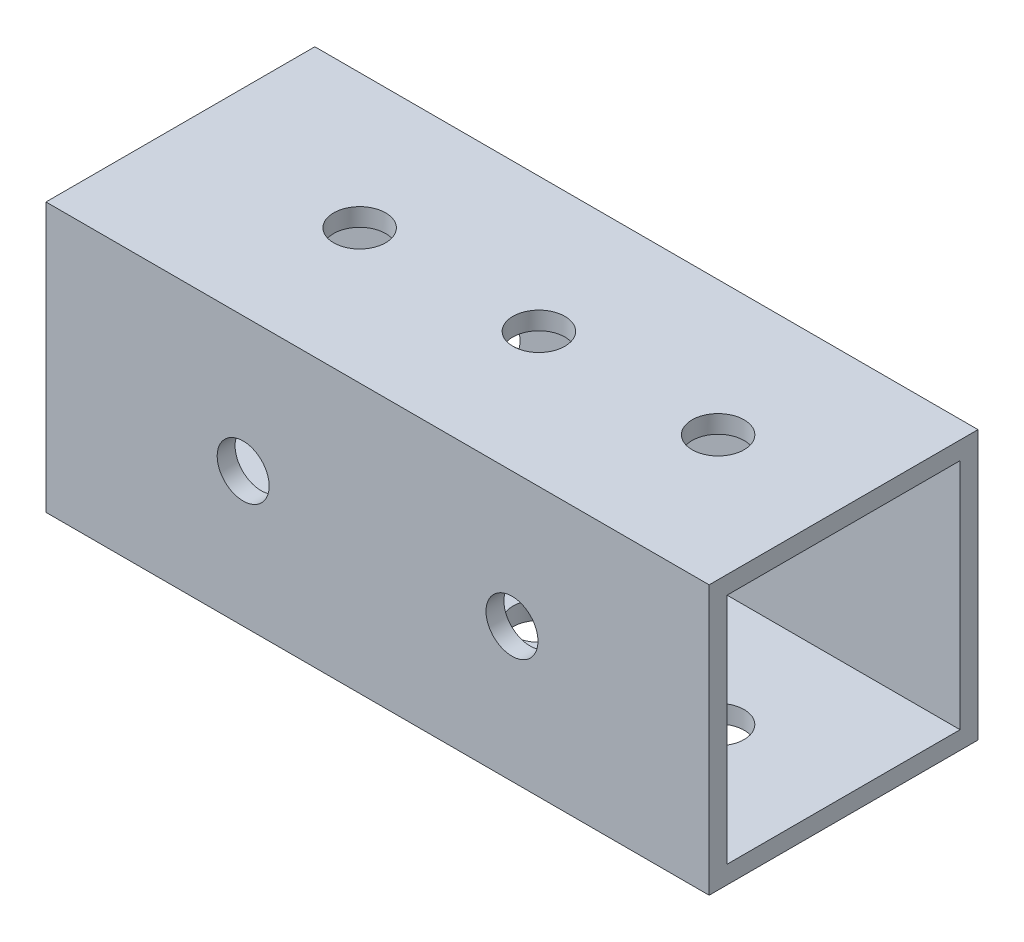
ISO-10303-21;
HEADER;
FILE_DESCRIPTION(('STEP AP214'),'2;1');
FILE_NAME('part.step','',(''),(''),'','','');
FILE_SCHEMA(('AUTOMOTIVE_DESIGN { 1 0 10303 214 1 1 1 1 }'));
ENDSEC;
DATA;
#1=APPLICATION_CONTEXT('core data for automotive mechanical design processes');
#2=APPLICATION_PROTOCOL_DEFINITION('international standard','automotive_design',2000,#1);
#3=PRODUCT_CONTEXT('',#1,'mechanical');
#4=PRODUCT('Part','Part','',(#3));
#5=PRODUCT_RELATED_PRODUCT_CATEGORY('part','',(#4));
#6=PRODUCT_DEFINITION_FORMATION('','',#4);
#7=PRODUCT_DEFINITION_CONTEXT('part definition',#1,'design');
#8=PRODUCT_DEFINITION('design','',#6,#7);
#9=PRODUCT_DEFINITION_SHAPE('','',#8);
#10=(LENGTH_UNIT() NAMED_UNIT(*) SI_UNIT(.MILLI.,.METRE.));
#11=(NAMED_UNIT(*) PLANE_ANGLE_UNIT() SI_UNIT($,.RADIAN.));
#12=(NAMED_UNIT(*) SI_UNIT($,.STERADIAN.) SOLID_ANGLE_UNIT());
#13=UNCERTAINTY_MEASURE_WITH_UNIT(LENGTH_MEASURE(1.E-05),#10,'distance_accuracy_value','');
#14=(GEOMETRIC_REPRESENTATION_CONTEXT(3) GLOBAL_UNCERTAINTY_ASSIGNED_CONTEXT((#13)) GLOBAL_UNIT_ASSIGNED_CONTEXT((#10,
#11,#12)) REPRESENTATION_CONTEXT('',''));
#15=CARTESIAN_POINT('',(0.,0.,0.));
#16=DIRECTION('',(0.,0.,1.));
#17=DIRECTION('',(1.,0.,0.));
#18=AXIS2_PLACEMENT_3D('',#15,#16,#17);
#19=CARTESIAN_POINT('',(37.,0.,0.));
#20=DIRECTION('',(-1.,0.,0.));
#21=DIRECTION('',(0.,0.,1.));
#22=AXIS2_PLACEMENT_3D('',#19,#20,#21);
#23=PLANE('',#22);
#24=DIRECTION('',(0.,1.,0.));
#25=VECTOR('',#24,1.);
#26=CARTESIAN_POINT('',(37.,-7.5,-7.5));
#27=LINE('',#26,#25);
#28=CARTESIAN_POINT('',(37.,-7.5,-7.5));
#29=VERTEX_POINT('',#28);
#30=CARTESIAN_POINT('',(37.,7.5,-7.5));
#31=VERTEX_POINT('',#30);
#32=EDGE_CURVE('E146',#29,#31,#27,.T.);
#33=ORIENTED_EDGE('',*,*,#32,.T.);
#34=DIRECTION('',(0.,0.,1.));
#35=VECTOR('',#34,1.);
#36=CARTESIAN_POINT('',(37.,7.5,7.5));
#37=LINE('',#36,#35);
#38=CARTESIAN_POINT('',(37.,7.5,7.5));
#39=VERTEX_POINT('',#38);
#40=EDGE_CURVE('E149',#31,#39,#37,.T.);
#41=ORIENTED_EDGE('',*,*,#40,.T.);
#42=DIRECTION('',(0.,-1.,0.));
#43=VECTOR('',#42,1.);
#44=CARTESIAN_POINT('',(37.,-7.5,7.5));
#45=LINE('',#44,#43);
#46=CARTESIAN_POINT('',(37.,-7.5,7.5));
#47=VERTEX_POINT('',#46);
#48=EDGE_CURVE('E152',#39,#47,#45,.T.);
#49=ORIENTED_EDGE('',*,*,#48,.T.);
#50=DIRECTION('',(0.,0.,-1.));
#51=VECTOR('',#50,1.);
#52=CARTESIAN_POINT('',(37.,-7.5,7.5));
#53=LINE('',#52,#51);
#54=EDGE_CURVE('E154',#47,#29,#53,.T.);
#55=ORIENTED_EDGE('',*,*,#54,.T.);
#56=EDGE_LOOP('',(#33,#41,#49,#55));
#57=FACE_BOUND('',#56,.T.);
#58=DIRECTION('',(0.,0.,-1.));
#59=VECTOR('',#58,1.);
#60=CARTESIAN_POINT('',(37.,-6.5,6.5));
#61=LINE('',#60,#59);
#62=CARTESIAN_POINT('',(37.,-6.5,6.5));
#63=VERTEX_POINT('',#62);
#64=CARTESIAN_POINT('',(37.,-6.5,-6.5));
#65=VERTEX_POINT('',#64);
#66=EDGE_CURVE('E108',#63,#65,#61,.T.);
#67=ORIENTED_EDGE('',*,*,#66,.F.);
#68=DIRECTION('',(0.,-1.,0.));
#69=VECTOR('',#68,1.);
#70=CARTESIAN_POINT('',(37.,-6.5,6.5));
#71=LINE('',#70,#69);
#72=CARTESIAN_POINT('',(37.,6.5,6.5));
#73=VERTEX_POINT('',#72);
#74=EDGE_CURVE('E130',#73,#63,#71,.T.);
#75=ORIENTED_EDGE('',*,*,#74,.F.);
#76=DIRECTION('',(0.,0.,1.));
#77=VECTOR('',#76,1.);
#78=CARTESIAN_POINT('',(37.,6.5,6.5));
#79=LINE('',#78,#77);
#80=CARTESIAN_POINT('',(37.,6.5,-6.5));
#81=VERTEX_POINT('',#80);
#82=EDGE_CURVE('E128',#81,#73,#79,.T.);
#83=ORIENTED_EDGE('',*,*,#82,.F.);
#84=DIRECTION('',(0.,1.,0.));
#85=VECTOR('',#84,1.);
#86=CARTESIAN_POINT('',(37.,-6.5,-6.5));
#87=LINE('',#86,#85);
#88=EDGE_CURVE('E116',#65,#81,#87,.T.);
#89=ORIENTED_EDGE('',*,*,#88,.F.);
#90=EDGE_LOOP('',(#67,#75,#83,#89));
#91=FACE_BOUND('',#90,.T.);
#92=ADVANCED_FACE('F41',(#57,#91),#23,.F.);
#93=CARTESIAN_POINT('',(0.,0.,0.));
#94=DIRECTION('',(-1.,0.,0.));
#95=DIRECTION('',(0.,0.,1.));
#96=AXIS2_PLACEMENT_3D('',#93,#94,#95);
#97=PLANE('',#96);
#98=DIRECTION('',(0.,1.,0.));
#99=VECTOR('',#98,1.);
#100=CARTESIAN_POINT('',(0.,-7.5,-7.5));
#101=LINE('',#100,#99);
#102=CARTESIAN_POINT('',(0.,-7.5,-7.5));
#103=VERTEX_POINT('',#102);
#104=CARTESIAN_POINT('',(0.,7.5,-7.5));
#105=VERTEX_POINT('',#104);
#106=EDGE_CURVE('E124',#103,#105,#101,.T.);
#107=ORIENTED_EDGE('',*,*,#106,.F.);
#108=DIRECTION('',(0.,0.,-1.));
#109=VECTOR('',#108,1.);
#110=CARTESIAN_POINT('',(0.,-7.5,7.5));
#111=LINE('',#110,#109);
#112=CARTESIAN_POINT('',(0.,-7.5,7.5));
#113=VERTEX_POINT('',#112);
#114=EDGE_CURVE('E150',#113,#103,#111,.T.);
#115=ORIENTED_EDGE('',*,*,#114,.F.);
#116=DIRECTION('',(0.,-1.,0.));
#117=VECTOR('',#116,1.);
#118=CARTESIAN_POINT('',(0.,-7.5,7.5));
#119=LINE('',#118,#117);
#120=CARTESIAN_POINT('',(0.,7.5,7.5));
#121=VERTEX_POINT('',#120);
#122=EDGE_CURVE('E161',#121,#113,#119,.T.);
#123=ORIENTED_EDGE('',*,*,#122,.F.);
#124=DIRECTION('',(0.,0.,1.));
#125=VECTOR('',#124,1.);
#126=CARTESIAN_POINT('',(0.,7.5,7.5));
#127=LINE('',#126,#125);
#128=EDGE_CURVE('E159',#105,#121,#127,.T.);
#129=ORIENTED_EDGE('',*,*,#128,.F.);
#130=EDGE_LOOP('',(#107,#115,#123,#129));
#131=FACE_BOUND('',#130,.T.);
#132=DIRECTION('',(0.,-1.,0.));
#133=VECTOR('',#132,1.);
#134=CARTESIAN_POINT('',(0.,-6.5,6.5));
#135=LINE('',#134,#133);
#136=CARTESIAN_POINT('',(0.,6.5,6.5));
#137=VERTEX_POINT('',#136);
#138=CARTESIAN_POINT('',(0.,-6.5,6.5));
#139=VERTEX_POINT('',#138);
#140=EDGE_CURVE('E117',#137,#139,#135,.T.);
#141=ORIENTED_EDGE('',*,*,#140,.T.);
#142=DIRECTION('',(0.,0.,-1.));
#143=VECTOR('',#142,1.);
#144=CARTESIAN_POINT('',(0.,-6.5,6.5));
#145=LINE('',#144,#143);
#146=CARTESIAN_POINT('',(0.,-6.5,-6.5));
#147=VERTEX_POINT('',#146);
#148=EDGE_CURVE('E66',#139,#147,#145,.T.);
#149=ORIENTED_EDGE('',*,*,#148,.T.);
#150=DIRECTION('',(0.,1.,0.));
#151=VECTOR('',#150,1.);
#152=CARTESIAN_POINT('',(0.,-6.5,-6.5));
#153=LINE('',#152,#151);
#154=CARTESIAN_POINT('',(0.,6.5,-6.5));
#155=VERTEX_POINT('',#154);
#156=EDGE_CURVE('E123',#147,#155,#153,.T.);
#157=ORIENTED_EDGE('',*,*,#156,.T.);
#158=DIRECTION('',(0.,0.,1.));
#159=VECTOR('',#158,1.);
#160=CARTESIAN_POINT('',(0.,6.5,6.5));
#161=LINE('',#160,#159);
#162=EDGE_CURVE('E138',#155,#137,#161,.T.);
#163=ORIENTED_EDGE('',*,*,#162,.T.);
#164=EDGE_LOOP('',(#141,#149,#157,#163));
#165=FACE_BOUND('',#164,.T.);
#166=ADVANCED_FACE('F236',(#131,#165),#97,.T.);
#167=CARTESIAN_POINT('',(37.,-7.5,-7.5));
#168=DIRECTION('',(0.,0.,1.));
#169=DIRECTION('',(1.,0.,0.));
#170=AXIS2_PLACEMENT_3D('',#167,#168,#169);
#171=PLANE('',#170);
#172=CARTESIAN_POINT('',(11.0000000000011,-6.33174068731535E-13,-7.5));
#173=DIRECTION('',(0.,0.,-1.));
#174=DIRECTION('',(-1.,0.,0.));
#175=AXIS2_PLACEMENT_3D('',#172,#173,#174);
#176=CIRCLE('',#175,1.45);
#177=CARTESIAN_POINT('',(9.55000000000112,-6.33174068731535E-13,-7.5));
#178=VERTEX_POINT('',#177);
#179=EDGE_CURVE('E204',#178,#178,#176,.T.);
#180=ORIENTED_EDGE('',*,*,#179,.F.);
#181=EDGE_LOOP('',(#180));
#182=FACE_BOUND('',#181,.T.);
#183=CARTESIAN_POINT('',(26.0000000000011,-6.34908792207511E-13,-7.5));
#184=DIRECTION('',(0.,0.,-1.));
#185=DIRECTION('',(-1.,0.,0.));
#186=AXIS2_PLACEMENT_3D('',#183,#184,#185);
#187=CIRCLE('',#186,1.45);
#188=CARTESIAN_POINT('',(24.5500000000011,-6.34908792207511E-13,-7.5));
#189=VERTEX_POINT('',#188);
#190=EDGE_CURVE('E207',#189,#189,#187,.T.);
#191=ORIENTED_EDGE('',*,*,#190,.F.);
#192=EDGE_LOOP('',(#191));
#193=FACE_BOUND('',#192,.T.);
#194=ORIENTED_EDGE('',*,*,#106,.T.);
#195=DIRECTION('',(-1.,0.,0.));
#196=VECTOR('',#195,1.);
#197=CARTESIAN_POINT('',(37.,7.5,-7.5));
#198=LINE('',#197,#196);
#199=EDGE_CURVE('E11',#31,#105,#198,.T.);
#200=ORIENTED_EDGE('',*,*,#199,.F.);
#201=ORIENTED_EDGE('',*,*,#32,.F.);
#202=DIRECTION('',(-1.,0.,0.));
#203=VECTOR('',#202,1.);
#204=CARTESIAN_POINT('',(37.,-7.5,-7.5));
#205=LINE('',#204,#203);
#206=EDGE_CURVE('E156',#29,#103,#205,.T.);
#207=ORIENTED_EDGE('',*,*,#206,.T.);
#208=EDGE_LOOP('',(#194,#200,#201,#207));
#209=FACE_BOUND('',#208,.T.);
#210=ADVANCED_FACE('F43',(#182,#193,#209),#171,.F.);
#211=CARTESIAN_POINT('',(37.,7.5,7.5));
#212=DIRECTION('',(0.,-1.,0.));
#213=DIRECTION('',(0.,0.,-1.));
#214=AXIS2_PLACEMENT_3D('',#211,#212,#213);
#215=PLANE('',#214);
#216=CARTESIAN_POINT('',(10.0000000000002,7.5,-3.35169282420944E-13));
#217=DIRECTION('',(0.,1.,0.));
#218=DIRECTION('',(0.,0.,1.));
#219=AXIS2_PLACEMENT_3D('',#216,#217,#218);
#220=CIRCLE('',#219,1.45);
#221=CARTESIAN_POINT('',(10.0000000000002,7.5,1.44999999999966));
#222=VERTEX_POINT('',#221);
#223=EDGE_CURVE('E317',#222,#222,#220,.T.);
#224=ORIENTED_EDGE('',*,*,#223,.F.);
#225=EDGE_LOOP('',(#224));
#226=FACE_BOUND('',#225,.T.);
#227=CARTESIAN_POINT('',(30.0000000000002,7.5,-3.29618167297818E-13));
#228=DIRECTION('',(0.,1.,0.));
#229=DIRECTION('',(0.,0.,1.));
#230=AXIS2_PLACEMENT_3D('',#227,#228,#229);
#231=CIRCLE('',#230,1.45);
#232=CARTESIAN_POINT('',(30.0000000000002,7.5,1.44999999999967));
#233=VERTEX_POINT('',#232);
#234=EDGE_CURVE('E320',#233,#233,#231,.T.);
#235=ORIENTED_EDGE('',*,*,#234,.F.);
#236=EDGE_LOOP('',(#235));
#237=FACE_BOUND('',#236,.T.);
#238=CARTESIAN_POINT('',(20.0000000000002,7.5,-3.32393724859381E-13));
#239=DIRECTION('',(0.,1.,0.));
#240=DIRECTION('',(0.,0.,1.));
#241=AXIS2_PLACEMENT_3D('',#238,#239,#240);
#242=CIRCLE('',#241,1.45);
#243=CARTESIAN_POINT('',(20.0000000000002,7.5,1.44999999999967));
#244=VERTEX_POINT('',#243);
#245=EDGE_CURVE('E327',#244,#244,#242,.T.);
#246=ORIENTED_EDGE('',*,*,#245,.F.);
#247=EDGE_LOOP('',(#246));
#248=FACE_BOUND('',#247,.T.);
#249=ORIENTED_EDGE('',*,*,#128,.T.);
#250=DIRECTION('',(-1.,0.,0.));
#251=VECTOR('',#250,1.);
#252=CARTESIAN_POINT('',(37.,7.5,7.5));
#253=LINE('',#252,#251);
#254=EDGE_CURVE('E50',#39,#121,#253,.T.);
#255=ORIENTED_EDGE('',*,*,#254,.F.);
#256=ORIENTED_EDGE('',*,*,#40,.F.);
#257=ORIENTED_EDGE('',*,*,#199,.T.);
#258=EDGE_LOOP('',(#249,#255,#256,#257));
#259=FACE_BOUND('',#258,.T.);
#260=ADVANCED_FACE('F235',(#226,#237,#248,#259),#215,.F.);
#261=CARTESIAN_POINT('',(37.,-7.5,7.5));
#262=DIRECTION('',(0.,0.,-1.));
#263=DIRECTION('',(-1.,0.,0.));
#264=AXIS2_PLACEMENT_3D('',#261,#262,#263);
#265=PLANE('',#264);
#266=CARTESIAN_POINT('',(11.0000000000011,-6.33174068731535E-13,7.5));
#267=DIRECTION('',(0.,0.,-1.));
#268=DIRECTION('',(-1.,0.,0.));
#269=AXIS2_PLACEMENT_3D('',#266,#267,#268);
#270=CIRCLE('',#269,1.45);
#271=CARTESIAN_POINT('',(9.55000000000112,-6.33174068731535E-13,7.5));
#272=VERTEX_POINT('',#271);
#273=EDGE_CURVE('E175',#272,#272,#270,.T.);
#274=ORIENTED_EDGE('',*,*,#273,.T.);
#275=EDGE_LOOP('',(#274));
#276=FACE_BOUND('',#275,.T.);
#277=CARTESIAN_POINT('',(26.0000000000011,-6.34908792207511E-13,7.5));
#278=DIRECTION('',(0.,0.,-1.));
#279=DIRECTION('',(-1.,0.,0.));
#280=AXIS2_PLACEMENT_3D('',#277,#278,#279);
#281=CIRCLE('',#280,1.45);
#282=CARTESIAN_POINT('',(24.5500000000011,-6.34908792207511E-13,7.5));
#283=VERTEX_POINT('',#282);
#284=EDGE_CURVE('E201',#283,#283,#281,.T.);
#285=ORIENTED_EDGE('',*,*,#284,.T.);
#286=EDGE_LOOP('',(#285));
#287=FACE_BOUND('',#286,.T.);
#288=ORIENTED_EDGE('',*,*,#122,.T.);
#289=DIRECTION('',(-1.,0.,0.));
#290=VECTOR('',#289,1.);
#291=CARTESIAN_POINT('',(37.,-7.5,7.5));
#292=LINE('',#291,#290);
#293=EDGE_CURVE('E166',#47,#113,#292,.T.);
#294=ORIENTED_EDGE('',*,*,#293,.F.);
#295=ORIENTED_EDGE('',*,*,#48,.F.);
#296=ORIENTED_EDGE('',*,*,#254,.T.);
#297=EDGE_LOOP('',(#288,#294,#295,#296));
#298=FACE_BOUND('',#297,.T.);
#299=ADVANCED_FACE('F255',(#276,#287,#298),#265,.F.);
#300=CARTESIAN_POINT('',(37.,-7.5,7.5));
#301=DIRECTION('',(0.,1.,0.));
#302=DIRECTION('',(0.,0.,1.));
#303=AXIS2_PLACEMENT_3D('',#300,#301,#302);
#304=PLANE('',#303);
#305=CARTESIAN_POINT('',(10.0000000000002,-7.5,-3.35169282420944E-13));
#306=DIRECTION('',(0.,1.,0.));
#307=DIRECTION('',(0.,0.,1.));
#308=AXIS2_PLACEMENT_3D('',#305,#306,#307);
#309=CIRCLE('',#308,1.45);
#310=CARTESIAN_POINT('',(10.0000000000002,-7.5,1.44999999999966));
#311=VERTEX_POINT('',#310);
#312=EDGE_CURVE('E182',#311,#311,#309,.T.);
#313=ORIENTED_EDGE('',*,*,#312,.T.);
#314=EDGE_LOOP('',(#313));
#315=FACE_BOUND('',#314,.T.);
#316=CARTESIAN_POINT('',(30.0000000000002,-7.5,-3.29618167297818E-13));
#317=DIRECTION('',(0.,1.,0.));
#318=DIRECTION('',(0.,0.,1.));
#319=AXIS2_PLACEMENT_3D('',#316,#317,#318);
#320=CIRCLE('',#319,1.45);
#321=CARTESIAN_POINT('',(30.0000000000002,-7.5,1.44999999999967));
#322=VERTEX_POINT('',#321);
#323=EDGE_CURVE('E325',#322,#322,#320,.T.);
#324=ORIENTED_EDGE('',*,*,#323,.T.);
#325=EDGE_LOOP('',(#324));
#326=FACE_BOUND('',#325,.T.);
#327=CARTESIAN_POINT('',(20.0000000000002,-7.5,-3.32393724859381E-13));
#328=DIRECTION('',(0.,1.,0.));
#329=DIRECTION('',(0.,0.,1.));
#330=AXIS2_PLACEMENT_3D('',#327,#328,#329);
#331=CIRCLE('',#330,1.45);
#332=CARTESIAN_POINT('',(20.0000000000002,-7.5,1.44999999999967));
#333=VERTEX_POINT('',#332);
#334=EDGE_CURVE('E195',#333,#333,#331,.T.);
#335=ORIENTED_EDGE('',*,*,#334,.T.);
#336=EDGE_LOOP('',(#335));
#337=FACE_BOUND('',#336,.T.);
#338=ORIENTED_EDGE('',*,*,#114,.T.);
#339=ORIENTED_EDGE('',*,*,#206,.F.);
#340=ORIENTED_EDGE('',*,*,#54,.F.);
#341=ORIENTED_EDGE('',*,*,#293,.T.);
#342=EDGE_LOOP('',(#338,#339,#340,#341));
#343=FACE_BOUND('',#342,.T.);
#344=ADVANCED_FACE('F253',(#315,#326,#337,#343),#304,.F.);
#345=CARTESIAN_POINT('',(37.,-6.5,6.5));
#346=DIRECTION('',(0.,1.,0.));
#347=DIRECTION('',(0.,0.,1.));
#348=AXIS2_PLACEMENT_3D('',#345,#346,#347);
#349=PLANE('',#348);
#350=CARTESIAN_POINT('',(10.0000000000002,-6.5,-3.35169282420944E-13));
#351=DIRECTION('',(0.,1.,0.));
#352=DIRECTION('',(0.,0.,1.));
#353=AXIS2_PLACEMENT_3D('',#350,#351,#352);
#354=CIRCLE('',#353,1.45);
#355=CARTESIAN_POINT('',(10.0000000000002,-6.5,1.44999999999966));
#356=VERTEX_POINT('',#355);
#357=EDGE_CURVE('E198',#356,#356,#354,.T.);
#358=ORIENTED_EDGE('',*,*,#357,.F.);
#359=EDGE_LOOP('',(#358));
#360=FACE_BOUND('',#359,.T.);
#361=CARTESIAN_POINT('',(30.0000000000002,-6.5,-3.29618167297818E-13));
#362=DIRECTION('',(0.,1.,0.));
#363=DIRECTION('',(0.,0.,1.));
#364=AXIS2_PLACEMENT_3D('',#361,#362,#363);
#365=CIRCLE('',#364,1.45);
#366=CARTESIAN_POINT('',(30.0000000000002,-6.5,1.44999999999967));
#367=VERTEX_POINT('',#366);
#368=EDGE_CURVE('E185',#367,#367,#365,.T.);
#369=ORIENTED_EDGE('',*,*,#368,.F.);
#370=EDGE_LOOP('',(#369));
#371=FACE_BOUND('',#370,.T.);
#372=CARTESIAN_POINT('',(20.0000000000002,-6.5,-3.32393724859381E-13));
#373=DIRECTION('',(0.,1.,0.));
#374=DIRECTION('',(0.,0.,1.));
#375=AXIS2_PLACEMENT_3D('',#372,#373,#374);
#376=CIRCLE('',#375,1.45);
#377=CARTESIAN_POINT('',(20.0000000000002,-6.5,1.44999999999967));
#378=VERTEX_POINT('',#377);
#379=EDGE_CURVE('E181',#378,#378,#376,.T.);
#380=ORIENTED_EDGE('',*,*,#379,.F.);
#381=EDGE_LOOP('',(#380));
#382=FACE_BOUND('',#381,.T.);
#383=ORIENTED_EDGE('',*,*,#148,.F.);
#384=DIRECTION('',(-1.,0.,0.));
#385=VECTOR('',#384,1.);
#386=CARTESIAN_POINT('',(37.,-6.5,6.5));
#387=LINE('',#386,#385);
#388=EDGE_CURVE('E112',#63,#139,#387,.T.);
#389=ORIENTED_EDGE('',*,*,#388,.F.);
#390=ORIENTED_EDGE('',*,*,#66,.T.);
#391=DIRECTION('',(-1.,0.,0.));
#392=VECTOR('',#391,1.);
#393=CARTESIAN_POINT('',(37.,-6.5,-6.5));
#394=LINE('',#393,#392);
#395=EDGE_CURVE('E111',#65,#147,#394,.T.);
#396=ORIENTED_EDGE('',*,*,#395,.T.);
#397=EDGE_LOOP('',(#383,#389,#390,#396));
#398=FACE_BOUND('',#397,.T.);
#399=ADVANCED_FACE('F110',(#360,#371,#382,#398),#349,.T.);
#400=CARTESIAN_POINT('',(37.,-6.5,-6.5));
#401=DIRECTION('',(0.,0.,1.));
#402=DIRECTION('',(0.,-1.,0.));
#403=AXIS2_PLACEMENT_3D('',#400,#401,#402);
#404=PLANE('',#403);
#405=CARTESIAN_POINT('',(11.0000000000011,-6.33174068731535E-13,-6.5));
#406=DIRECTION('',(0.,0.,1.));
#407=DIRECTION('',(0.,-1.,0.));
#408=AXIS2_PLACEMENT_3D('',#405,#406,#407);
#409=CIRCLE('',#408,1.45);
#410=CARTESIAN_POINT('',(11.0000000000011,-1.45000000000063,-6.5));
#411=VERTEX_POINT('',#410);
#412=EDGE_CURVE('E136',#411,#411,#409,.T.);
#413=ORIENTED_EDGE('',*,*,#412,.F.);
#414=EDGE_LOOP('',(#413));
#415=FACE_BOUND('',#414,.T.);
#416=CARTESIAN_POINT('',(26.0000000000011,-6.34908792207511E-13,-6.5));
#417=DIRECTION('',(0.,0.,1.));
#418=DIRECTION('',(0.,-1.,0.));
#419=AXIS2_PLACEMENT_3D('',#416,#417,#418);
#420=CIRCLE('',#419,1.45);
#421=CARTESIAN_POINT('',(26.0000000000011,-1.45000000000063,-6.5));
#422=VERTEX_POINT('',#421);
#423=EDGE_CURVE('E174',#422,#422,#420,.T.);
#424=ORIENTED_EDGE('',*,*,#423,.F.);
#425=EDGE_LOOP('',(#424));
#426=FACE_BOUND('',#425,.T.);
#427=ORIENTED_EDGE('',*,*,#156,.F.);
#428=ORIENTED_EDGE('',*,*,#395,.F.);
#429=ORIENTED_EDGE('',*,*,#88,.T.);
#430=DIRECTION('',(-1.,0.,0.));
#431=VECTOR('',#430,1.);
#432=CARTESIAN_POINT('',(37.,6.5,-6.5));
#433=LINE('',#432,#431);
#434=EDGE_CURVE('E125',#81,#155,#433,.T.);
#435=ORIENTED_EDGE('',*,*,#434,.T.);
#436=EDGE_LOOP('',(#427,#428,#429,#435));
#437=FACE_BOUND('',#436,.T.);
#438=ADVANCED_FACE('F120',(#415,#426,#437),#404,.T.);
#439=CARTESIAN_POINT('',(37.,6.5,6.5));
#440=DIRECTION('',(0.,-1.,0.));
#441=DIRECTION('',(0.,0.,-1.));
#442=AXIS2_PLACEMENT_3D('',#439,#440,#441);
#443=PLANE('',#442);
#444=CARTESIAN_POINT('',(10.0000000000002,6.5,-3.35169282420944E-13));
#445=DIRECTION('',(0.,-1.,0.));
#446=DIRECTION('',(0.,0.,-1.));
#447=AXIS2_PLACEMENT_3D('',#444,#445,#446);
#448=CIRCLE('',#447,1.45);
#449=CARTESIAN_POINT('',(10.0000000000002,6.5,-1.45000000000034));
#450=VERTEX_POINT('',#449);
#451=EDGE_CURVE('E45',#450,#450,#448,.T.);
#452=ORIENTED_EDGE('',*,*,#451,.F.);
#453=EDGE_LOOP('',(#452));
#454=FACE_BOUND('',#453,.T.);
#455=CARTESIAN_POINT('',(30.0000000000002,6.5,-3.29618167297818E-13));
#456=DIRECTION('',(0.,-1.,0.));
#457=DIRECTION('',(0.,0.,-1.));
#458=AXIS2_PLACEMENT_3D('',#455,#456,#457);
#459=CIRCLE('',#458,1.45);
#460=CARTESIAN_POINT('',(30.0000000000002,6.5,-1.45000000000033));
#461=VERTEX_POINT('',#460);
#462=EDGE_CURVE('E183',#461,#461,#459,.T.);
#463=ORIENTED_EDGE('',*,*,#462,.F.);
#464=EDGE_LOOP('',(#463));
#465=FACE_BOUND('',#464,.T.);
#466=CARTESIAN_POINT('',(20.0000000000002,6.5,-3.32393724859381E-13));
#467=DIRECTION('',(0.,-1.,0.));
#468=DIRECTION('',(0.,0.,-1.));
#469=AXIS2_PLACEMENT_3D('',#466,#467,#468);
#470=CIRCLE('',#469,1.45);
#471=CARTESIAN_POINT('',(20.0000000000002,6.5,-1.45000000000033));
#472=VERTEX_POINT('',#471);
#473=EDGE_CURVE('E179',#472,#472,#470,.T.);
#474=ORIENTED_EDGE('',*,*,#473,.F.);
#475=EDGE_LOOP('',(#474));
#476=FACE_BOUND('',#475,.T.);
#477=ORIENTED_EDGE('',*,*,#162,.F.);
#478=ORIENTED_EDGE('',*,*,#434,.F.);
#479=ORIENTED_EDGE('',*,*,#82,.T.);
#480=DIRECTION('',(-1.,0.,0.));
#481=VECTOR('',#480,1.);
#482=CARTESIAN_POINT('',(37.,6.5,6.5));
#483=LINE('',#482,#481);
#484=EDGE_CURVE('E58',#73,#137,#483,.T.);
#485=ORIENTED_EDGE('',*,*,#484,.T.);
#486=EDGE_LOOP('',(#477,#478,#479,#485));
#487=FACE_BOUND('',#486,.T.);
#488=ADVANCED_FACE('F221',(#454,#465,#476,#487),#443,.T.);
#489=CARTESIAN_POINT('',(37.,-6.5,6.5));
#490=DIRECTION('',(0.,0.,-1.));
#491=DIRECTION('',(-1.,0.,0.));
#492=AXIS2_PLACEMENT_3D('',#489,#490,#491);
#493=PLANE('',#492);
#494=CARTESIAN_POINT('',(11.0000000000011,-6.33174068731535E-13,6.5));
#495=DIRECTION('',(0.,0.,-1.));
#496=DIRECTION('',(-1.,0.,0.));
#497=AXIS2_PLACEMENT_3D('',#494,#495,#496);
#498=CIRCLE('',#497,1.45);
#499=CARTESIAN_POINT('',(9.55000000000112,-6.33174068731535E-13,6.5));
#500=VERTEX_POINT('',#499);
#501=EDGE_CURVE('E176',#500,#500,#498,.T.);
#502=ORIENTED_EDGE('',*,*,#501,.F.);
#503=EDGE_LOOP('',(#502));
#504=FACE_BOUND('',#503,.T.);
#505=CARTESIAN_POINT('',(26.0000000000011,-6.34908792207511E-13,6.5));
#506=DIRECTION('',(0.,0.,-1.));
#507=DIRECTION('',(-1.,0.,0.));
#508=AXIS2_PLACEMENT_3D('',#505,#506,#507);
#509=CIRCLE('',#508,1.45);
#510=CARTESIAN_POINT('',(24.5500000000011,-6.34908792207511E-13,6.5));
#511=VERTEX_POINT('',#510);
#512=EDGE_CURVE('E171',#511,#511,#509,.T.);
#513=ORIENTED_EDGE('',*,*,#512,.F.);
#514=EDGE_LOOP('',(#513));
#515=FACE_BOUND('',#514,.T.);
#516=ORIENTED_EDGE('',*,*,#140,.F.);
#517=ORIENTED_EDGE('',*,*,#484,.F.);
#518=ORIENTED_EDGE('',*,*,#74,.T.);
#519=ORIENTED_EDGE('',*,*,#388,.T.);
#520=EDGE_LOOP('',(#516,#517,#518,#519));
#521=FACE_BOUND('',#520,.T.);
#522=ADVANCED_FACE('F279',(#504,#515,#521),#493,.T.);
#523=CARTESIAN_POINT('',(26.0000000000011,-6.34908792207511E-13,7.5));
#524=DIRECTION('',(0.,0.,-1.));
#525=DIRECTION('',(-1.,0.,0.));
#526=AXIS2_PLACEMENT_3D('',#523,#524,#525);
#527=CYLINDRICAL_SURFACE('',#526,1.45);
#528=ORIENTED_EDGE('',*,*,#512,.T.);
#529=EDGE_LOOP('',(#528));
#530=FACE_BOUND('',#529,.T.);
#531=ORIENTED_EDGE('',*,*,#284,.F.);
#532=EDGE_LOOP('',(#531));
#533=FACE_BOUND('',#532,.T.);
#534=ADVANCED_FACE('F230',(#530,#533),#527,.F.);
#535=CARTESIAN_POINT('',(11.0000000000011,-6.33174068731535E-13,7.5));
#536=DIRECTION('',(0.,0.,-1.));
#537=DIRECTION('',(-1.,0.,0.));
#538=AXIS2_PLACEMENT_3D('',#535,#536,#537);
#539=CYLINDRICAL_SURFACE('',#538,1.45);
#540=ORIENTED_EDGE('',*,*,#501,.T.);
#541=EDGE_LOOP('',(#540));
#542=FACE_BOUND('',#541,.T.);
#543=ORIENTED_EDGE('',*,*,#273,.F.);
#544=EDGE_LOOP('',(#543));
#545=FACE_BOUND('',#544,.T.);
#546=ADVANCED_FACE('F228',(#542,#545),#539,.F.);
#547=ORIENTED_EDGE('',*,*,#423,.T.);
#548=EDGE_LOOP('',(#547));
#549=FACE_BOUND('',#548,.T.);
#550=ORIENTED_EDGE('',*,*,#190,.T.);
#551=EDGE_LOOP('',(#550));
#552=FACE_BOUND('',#551,.T.);
#553=ADVANCED_FACE('F225',(#549,#552),#527,.F.);
#554=ORIENTED_EDGE('',*,*,#412,.T.);
#555=EDGE_LOOP('',(#554));
#556=FACE_BOUND('',#555,.T.);
#557=ORIENTED_EDGE('',*,*,#179,.T.);
#558=EDGE_LOOP('',(#557));
#559=FACE_BOUND('',#558,.T.);
#560=ADVANCED_FACE('F216',(#556,#559),#539,.F.);
#561=CARTESIAN_POINT('',(20.0000000000002,-7.5,-3.32393724859381E-13));
#562=DIRECTION('',(0.,1.,0.));
#563=DIRECTION('',(0.,0.,1.));
#564=AXIS2_PLACEMENT_3D('',#561,#562,#563);
#565=CYLINDRICAL_SURFACE('',#564,1.45);
#566=ORIENTED_EDGE('',*,*,#473,.T.);
#567=EDGE_LOOP('',(#566));
#568=FACE_BOUND('',#567,.T.);
#569=ORIENTED_EDGE('',*,*,#245,.T.);
#570=EDGE_LOOP('',(#569));
#571=FACE_BOUND('',#570,.T.);
#572=ADVANCED_FACE('F289',(#568,#571),#565,.F.);
#573=CARTESIAN_POINT('',(30.0000000000002,-7.5,-3.29618167297818E-13));
#574=DIRECTION('',(0.,1.,0.));
#575=DIRECTION('',(0.,0.,1.));
#576=AXIS2_PLACEMENT_3D('',#573,#574,#575);
#577=CYLINDRICAL_SURFACE('',#576,1.45);
#578=ORIENTED_EDGE('',*,*,#462,.T.);
#579=EDGE_LOOP('',(#578));
#580=FACE_BOUND('',#579,.T.);
#581=ORIENTED_EDGE('',*,*,#234,.T.);
#582=EDGE_LOOP('',(#581));
#583=FACE_BOUND('',#582,.T.);
#584=ADVANCED_FACE('F292',(#580,#583),#577,.F.);
#585=CARTESIAN_POINT('',(10.0000000000002,-7.5,-3.35169282420944E-13));
#586=DIRECTION('',(0.,1.,0.));
#587=DIRECTION('',(0.,0.,1.));
#588=AXIS2_PLACEMENT_3D('',#585,#586,#587);
#589=CYLINDRICAL_SURFACE('',#588,1.45);
#590=ORIENTED_EDGE('',*,*,#451,.T.);
#591=EDGE_LOOP('',(#590));
#592=FACE_BOUND('',#591,.T.);
#593=ORIENTED_EDGE('',*,*,#223,.T.);
#594=EDGE_LOOP('',(#593));
#595=FACE_BOUND('',#594,.T.);
#596=ADVANCED_FACE('F297',(#592,#595),#589,.F.);
#597=ORIENTED_EDGE('',*,*,#379,.T.);
#598=EDGE_LOOP('',(#597));
#599=FACE_BOUND('',#598,.T.);
#600=ORIENTED_EDGE('',*,*,#334,.F.);
#601=EDGE_LOOP('',(#600));
#602=FACE_BOUND('',#601,.T.);
#603=ADVANCED_FACE('F294',(#599,#602),#565,.F.);
#604=ORIENTED_EDGE('',*,*,#368,.T.);
#605=EDGE_LOOP('',(#604));
#606=FACE_BOUND('',#605,.T.);
#607=ORIENTED_EDGE('',*,*,#323,.F.);
#608=EDGE_LOOP('',(#607));
#609=FACE_BOUND('',#608,.T.);
#610=ADVANCED_FACE('F298',(#606,#609),#577,.F.);
#611=ORIENTED_EDGE('',*,*,#357,.T.);
#612=EDGE_LOOP('',(#611));
#613=FACE_BOUND('',#612,.T.);
#614=ORIENTED_EDGE('',*,*,#312,.F.);
#615=EDGE_LOOP('',(#614));
#616=FACE_BOUND('',#615,.T.);
#617=ADVANCED_FACE('F301',(#613,#616),#589,.F.);
#618=CLOSED_SHELL('',(#92,#166,#210,#260,#299,#344,#399,#438,#488,#522,#534,#546,#553,#560,#572,
#584,#596,#603,#610,#617));
#619=MANIFOLD_SOLID_BREP('B2',#618);
#620=ADVANCED_BREP_SHAPE_REPRESENTATION('',(#18,#619),#14);
#621=SHAPE_DEFINITION_REPRESENTATION(#9,#620);
ENDSEC;
END-ISO-10303-21;
